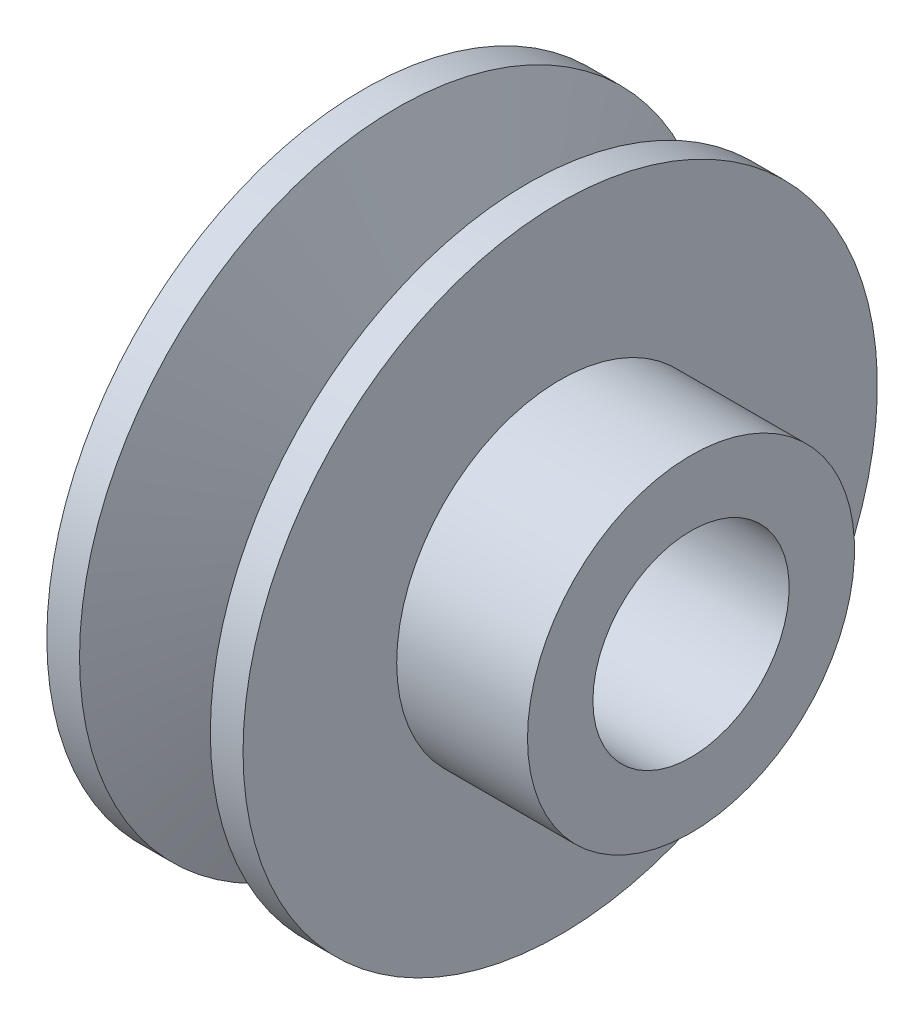
ISO-10303-21;
HEADER;
FILE_DESCRIPTION(('STEP AP214'),'2;1');
FILE_NAME('part.step','',(''),(''),'','','');
FILE_SCHEMA(('AUTOMOTIVE_DESIGN { 1 0 10303 214 1 1 1 1 }'));
ENDSEC;
DATA;
#1=APPLICATION_CONTEXT('core data for automotive mechanical design processes');
#2=APPLICATION_PROTOCOL_DEFINITION('international standard','automotive_design',2000,#1);
#3=PRODUCT_CONTEXT('',#1,'mechanical');
#4=PRODUCT('Part','Part','',(#3));
#5=PRODUCT_RELATED_PRODUCT_CATEGORY('part','',(#4));
#6=PRODUCT_DEFINITION_FORMATION('','',#4);
#7=PRODUCT_DEFINITION_CONTEXT('part definition',#1,'design');
#8=PRODUCT_DEFINITION('design','',#6,#7);
#9=PRODUCT_DEFINITION_SHAPE('','',#8);
#10=(LENGTH_UNIT() NAMED_UNIT(*) SI_UNIT(.MILLI.,.METRE.));
#11=(NAMED_UNIT(*) PLANE_ANGLE_UNIT() SI_UNIT($,.RADIAN.));
#12=(NAMED_UNIT(*) SI_UNIT($,.STERADIAN.) SOLID_ANGLE_UNIT());
#13=UNCERTAINTY_MEASURE_WITH_UNIT(LENGTH_MEASURE(1.E-05),#10,'distance_accuracy_value','');
#14=(GEOMETRIC_REPRESENTATION_CONTEXT(3) GLOBAL_UNCERTAINTY_ASSIGNED_CONTEXT((#13)) GLOBAL_UNIT_ASSIGNED_CONTEXT((#10,
#11,#12)) REPRESENTATION_CONTEXT('',''));
#15=CARTESIAN_POINT('',(0.,0.,0.));
#16=DIRECTION('',(0.,0.,1.));
#17=DIRECTION('',(1.,0.,0.));
#18=AXIS2_PLACEMENT_3D('',#15,#16,#17);
#19=CARTESIAN_POINT('',(0.,0.,0.));
#20=DIRECTION('',(-1.,0.,0.));
#21=DIRECTION('',(0.,0.,1.));
#22=AXIS2_PLACEMENT_3D('',#19,#20,#21);
#23=CYLINDRICAL_SURFACE('',#22,15.);
#24=CARTESIAN_POINT('',(5.,0.,0.));
#25=DIRECTION('',(-1.,0.,0.));
#26=DIRECTION('',(0.,0.,1.));
#27=AXIS2_PLACEMENT_3D('',#24,#25,#26);
#28=CIRCLE('',#27,15.);
#29=CARTESIAN_POINT('',(5.,0.,15.));
#30=VERTEX_POINT('',#29);
#31=EDGE_CURVE('E74',#30,#30,#28,.T.);
#32=ORIENTED_EDGE('',*,*,#31,.T.);
#33=EDGE_LOOP('',(#32));
#34=FACE_BOUND('',#33,.T.);
#35=CARTESIAN_POINT('',(50.,0.,0.));
#36=DIRECTION('',(-1.,0.,0.));
#37=DIRECTION('',(0.,0.,1.));
#38=AXIS2_PLACEMENT_3D('',#35,#36,#37);
#39=CIRCLE('',#38,15.);
#40=CARTESIAN_POINT('',(50.,0.,15.));
#41=VERTEX_POINT('',#40);
#42=EDGE_CURVE('E10',#41,#41,#39,.T.);
#43=ORIENTED_EDGE('',*,*,#42,.F.);
#44=EDGE_LOOP('',(#43));
#45=FACE_BOUND('',#44,.T.);
#46=ADVANCED_FACE('F38',(#34,#45),#23,.F.);
#47=CARTESIAN_POINT('',(50.,0.,0.));
#48=DIRECTION('',(1.,0.,0.));
#49=DIRECTION('',(0.,0.,-1.));
#50=AXIS2_PLACEMENT_3D('',#47,#48,#49);
#51=PLANE('',#50);
#52=ORIENTED_EDGE('',*,*,#42,.T.);
#53=EDGE_LOOP('',(#52));
#54=FACE_BOUND('',#53,.T.);
#55=CARTESIAN_POINT('',(50.,0.,0.));
#56=DIRECTION('',(-1.,0.,0.));
#57=DIRECTION('',(0.,0.,1.));
#58=AXIS2_PLACEMENT_3D('',#55,#56,#57);
#59=CIRCLE('',#58,25.);
#60=CARTESIAN_POINT('',(50.,0.,25.));
#61=VERTEX_POINT('',#60);
#62=EDGE_CURVE('E46',#61,#61,#59,.T.);
#63=ORIENTED_EDGE('',*,*,#62,.F.);
#64=EDGE_LOOP('',(#63));
#65=FACE_BOUND('',#64,.T.);
#66=ADVANCED_FACE('F92',(#54,#65),#51,.T.);
#67=CARTESIAN_POINT('',(0.,0.,0.));
#68=DIRECTION('',(-1.,0.,0.));
#69=DIRECTION('',(0.,0.,1.));
#70=AXIS2_PLACEMENT_3D('',#67,#68,#69);
#71=CYLINDRICAL_SURFACE('',#70,25.);
#72=ORIENTED_EDGE('',*,*,#62,.T.);
#73=EDGE_LOOP('',(#72));
#74=FACE_BOUND('',#73,.T.);
#75=CARTESIAN_POINT('',(30.,0.,0.));
#76=DIRECTION('',(-1.,0.,0.));
#77=DIRECTION('',(0.,0.,1.));
#78=AXIS2_PLACEMENT_3D('',#75,#76,#77);
#79=CIRCLE('',#78,25.);
#80=CARTESIAN_POINT('',(30.,0.,25.));
#81=VERTEX_POINT('',#80);
#82=EDGE_CURVE('E50',#81,#81,#79,.T.);
#83=ORIENTED_EDGE('',*,*,#82,.F.);
#84=EDGE_LOOP('',(#83));
#85=FACE_BOUND('',#84,.T.);
#86=ADVANCED_FACE('F96',(#74,#85),#71,.T.);
#87=CARTESIAN_POINT('',(30.,0.,0.));
#88=DIRECTION('',(1.,0.,0.));
#89=DIRECTION('',(0.,0.,-1.));
#90=AXIS2_PLACEMENT_3D('',#87,#88,#89);
#91=PLANE('',#90);
#92=ORIENTED_EDGE('',*,*,#82,.T.);
#93=EDGE_LOOP('',(#92));
#94=FACE_BOUND('',#93,.T.);
#95=CARTESIAN_POINT('',(30.,0.,0.));
#96=DIRECTION('',(-1.,0.,0.));
#97=DIRECTION('',(0.,0.,1.));
#98=AXIS2_PLACEMENT_3D('',#95,#96,#97);
#99=CIRCLE('',#98,48.4923155196477);
#100=CARTESIAN_POINT('',(30.,0.,48.4923155196477));
#101=VERTEX_POINT('',#100);
#102=EDGE_CURVE('E54',#101,#101,#99,.T.);
#103=ORIENTED_EDGE('',*,*,#102,.F.);
#104=EDGE_LOOP('',(#103));
#105=FACE_BOUND('',#104,.T.);
#106=ADVANCED_FACE('F101',(#94,#105),#91,.T.);
#107=CARTESIAN_POINT('',(0.,0.,0.));
#108=DIRECTION('',(-1.,0.,0.));
#109=DIRECTION('',(0.,0.,1.));
#110=AXIS2_PLACEMENT_3D('',#107,#108,#109);
#111=CYLINDRICAL_SURFACE('',#110,48.4923155196477);
#112=ORIENTED_EDGE('',*,*,#102,.T.);
#113=EDGE_LOOP('',(#112));
#114=FACE_BOUND('',#113,.T.);
#115=CARTESIAN_POINT('',(25.,0.,0.));
#116=DIRECTION('',(-1.,0.,0.));
#117=DIRECTION('',(0.,0.,1.));
#118=AXIS2_PLACEMENT_3D('',#115,#116,#117);
#119=CIRCLE('',#118,48.4923155196477);
#120=CARTESIAN_POINT('',(25.,0.,48.4923155196477));
#121=VERTEX_POINT('',#120);
#122=EDGE_CURVE('E59',#121,#121,#119,.T.);
#123=ORIENTED_EDGE('',*,*,#122,.F.);
#124=EDGE_LOOP('',(#123));
#125=FACE_BOUND('',#124,.T.);
#126=ADVANCED_FACE('F104',(#114,#125),#111,.T.);
#127=CARTESIAN_POINT('',(16.4494964168583,0.,0.));
#128=DIRECTION('',(1.,0.,0.));
#129=DIRECTION('',(0.,0.,-1.));
#130=AXIS2_PLACEMENT_3D('',#127,#128,#129);
#131=CONICAL_SURFACE('',#130,25.,1.22173047639603);
#132=ORIENTED_EDGE('',*,*,#122,.T.);
#133=EDGE_LOOP('',(#132));
#134=FACE_BOUND('',#133,.T.);
#135=CARTESIAN_POINT('',(16.4494964168583,0.,0.));
#136=DIRECTION('',(-1.,0.,0.));
#137=DIRECTION('',(0.,0.,1.));
#138=AXIS2_PLACEMENT_3D('',#135,#136,#137);
#139=CIRCLE('',#138,25.);
#140=CARTESIAN_POINT('',(16.4494964168583,0.,25.));
#141=VERTEX_POINT('',#140);
#142=EDGE_CURVE('E62',#141,#141,#139,.T.);
#143=ORIENTED_EDGE('',*,*,#142,.F.);
#144=EDGE_LOOP('',(#143));
#145=FACE_BOUND('',#144,.T.);
#146=ADVANCED_FACE('F108',(#134,#145),#131,.T.);
#147=CARTESIAN_POINT('',(0.,0.,0.));
#148=DIRECTION('',(-1.,0.,0.));
#149=DIRECTION('',(0.,0.,1.));
#150=AXIS2_PLACEMENT_3D('',#147,#148,#149);
#151=CYLINDRICAL_SURFACE('',#150,25.);
#152=ORIENTED_EDGE('',*,*,#142,.T.);
#153=EDGE_LOOP('',(#152));
#154=FACE_BOUND('',#153,.T.);
#155=CARTESIAN_POINT('',(13.5505035831416,0.,0.));
#156=DIRECTION('',(-1.,0.,0.));
#157=DIRECTION('',(0.,0.,1.));
#158=AXIS2_PLACEMENT_3D('',#155,#156,#157);
#159=CIRCLE('',#158,25.);
#160=CARTESIAN_POINT('',(13.5505035831416,0.,25.));
#161=VERTEX_POINT('',#160);
#162=EDGE_CURVE('E65',#161,#161,#159,.T.);
#163=ORIENTED_EDGE('',*,*,#162,.F.);
#164=EDGE_LOOP('',(#163));
#165=FACE_BOUND('',#164,.T.);
#166=ADVANCED_FACE('F112',(#154,#165),#151,.T.);
#167=CARTESIAN_POINT('',(5.,0.,0.));
#168=DIRECTION('',(-1.,0.,0.));
#169=DIRECTION('',(0.,0.,1.));
#170=AXIS2_PLACEMENT_3D('',#167,#168,#169);
#171=CONICAL_SURFACE('',#170,48.4923155196477,1.22173047639603);
#172=ORIENTED_EDGE('',*,*,#162,.T.);
#173=EDGE_LOOP('',(#172));
#174=FACE_BOUND('',#173,.T.);
#175=CARTESIAN_POINT('',(5.,0.,0.));
#176=DIRECTION('',(-1.,0.,0.));
#177=DIRECTION('',(0.,0.,1.));
#178=AXIS2_PLACEMENT_3D('',#175,#176,#177);
#179=CIRCLE('',#178,48.4923155196477);
#180=CARTESIAN_POINT('',(5.,0.,48.4923155196477));
#181=VERTEX_POINT('',#180);
#182=EDGE_CURVE('E68',#181,#181,#179,.T.);
#183=ORIENTED_EDGE('',*,*,#182,.F.);
#184=EDGE_LOOP('',(#183));
#185=FACE_BOUND('',#184,.T.);
#186=ADVANCED_FACE('F116',(#174,#185),#171,.T.);
#187=CARTESIAN_POINT('',(0.,0.,0.));
#188=DIRECTION('',(-1.,0.,0.));
#189=DIRECTION('',(0.,0.,1.));
#190=AXIS2_PLACEMENT_3D('',#187,#188,#189);
#191=CYLINDRICAL_SURFACE('',#190,48.4923155196477);
#192=ORIENTED_EDGE('',*,*,#182,.T.);
#193=EDGE_LOOP('',(#192));
#194=FACE_BOUND('',#193,.T.);
#195=CARTESIAN_POINT('',(0.,0.,0.));
#196=DIRECTION('',(-1.,0.,0.));
#197=DIRECTION('',(0.,0.,1.));
#198=AXIS2_PLACEMENT_3D('',#195,#196,#197);
#199=CIRCLE('',#198,48.4923155196477);
#200=CARTESIAN_POINT('',(0.,0.,48.4923155196477));
#201=VERTEX_POINT('',#200);
#202=EDGE_CURVE('E71',#201,#201,#199,.T.);
#203=ORIENTED_EDGE('',*,*,#202,.F.);
#204=EDGE_LOOP('',(#203));
#205=FACE_BOUND('',#204,.T.);
#206=ADVANCED_FACE('F88',(#194,#205),#191,.T.);
#207=CARTESIAN_POINT('',(0.,0.,0.));
#208=DIRECTION('',(-1.,0.,0.));
#209=DIRECTION('',(0.,0.,1.));
#210=AXIS2_PLACEMENT_3D('',#207,#208,#209);
#211=PLANE('',#210);
#212=ORIENTED_EDGE('',*,*,#202,.T.);
#213=EDGE_LOOP('',(#212));
#214=FACE_BOUND('',#213,.T.);
#215=ADVANCED_FACE('F82',(#214),#211,.T.);
#216=CARTESIAN_POINT('',(5.,0.,0.));
#217=DIRECTION('',(1.,0.,0.));
#218=DIRECTION('',(0.,0.,-1.));
#219=AXIS2_PLACEMENT_3D('',#216,#217,#218);
#220=PLANE('',#219);
#221=ORIENTED_EDGE('',*,*,#31,.F.);
#222=EDGE_LOOP('',(#221));
#223=FACE_BOUND('',#222,.T.);
#224=ADVANCED_FACE('F80',(#223),#220,.T.);
#225=CLOSED_SHELL('',(#46,#66,#86,#106,#126,#146,#166,#186,#206,#215,#224));
#226=CARTESIAN_POINT('',(40.,0.,0.));
#227=DIRECTION('',(-1.,0.,0.));
#228=DIRECTION('',(0.,0.,1.));
#229=AXIS2_PLACEMENT_3D('',#226,#227,#228);
#230=TOROIDAL_SURFACE('',#229,20.511791120592,1.5);
#231=CARTESIAN_POINT('',(40.,0.,22.011791120592));
#232=VERTEX_POINT('',#231);
#233=VERTEX_LOOP('',#232);
#234=FACE_BOUND('',#233,.T.);
#235=ADVANCED_FACE('F40',(#234),#230,.F.);
#236=CLOSED_SHELL('',(#235));
#237=ORIENTED_CLOSED_SHELL('',*,#236,.T.);
#238=BREP_WITH_VOIDS('B2',#225,(#237));
#239=ADVANCED_BREP_SHAPE_REPRESENTATION('',(#18,#238),#14);
#240=SHAPE_DEFINITION_REPRESENTATION(#9,#239);
ENDSEC;
END-ISO-10303-21;
